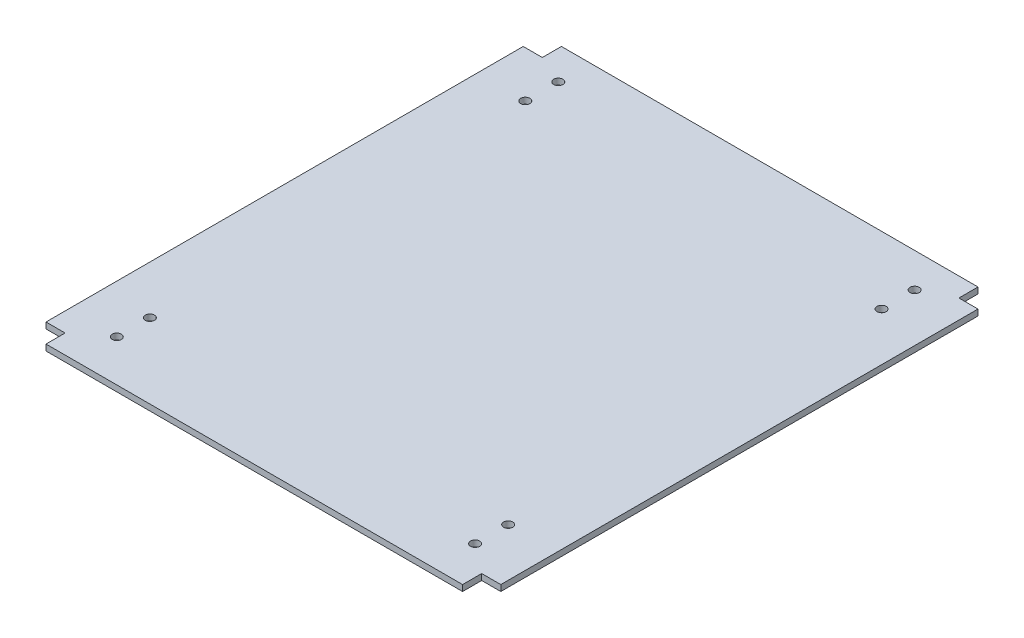
ISO-10303-21;
HEADER;
FILE_DESCRIPTION(('STEP AP214'),'2;1');
FILE_NAME('part.step','',(''),(''),'','','');
FILE_SCHEMA(('AUTOMOTIVE_DESIGN { 1 0 10303 214 1 1 1 1 }'));
ENDSEC;
DATA;
#1=APPLICATION_CONTEXT('core data for automotive mechanical design processes');
#2=APPLICATION_PROTOCOL_DEFINITION('international standard','automotive_design',2000,#1);
#3=PRODUCT_CONTEXT('',#1,'mechanical');
#4=PRODUCT('Part','Part','',(#3));
#5=PRODUCT_RELATED_PRODUCT_CATEGORY('part','',(#4));
#6=PRODUCT_DEFINITION_FORMATION('','',#4);
#7=PRODUCT_DEFINITION_CONTEXT('part definition',#1,'design');
#8=PRODUCT_DEFINITION('design','',#6,#7);
#9=PRODUCT_DEFINITION_SHAPE('','',#8);
#10=(LENGTH_UNIT() NAMED_UNIT(*) SI_UNIT(.MILLI.,.METRE.));
#11=(NAMED_UNIT(*) PLANE_ANGLE_UNIT() SI_UNIT($,.RADIAN.));
#12=(NAMED_UNIT(*) SI_UNIT($,.STERADIAN.) SOLID_ANGLE_UNIT());
#13=UNCERTAINTY_MEASURE_WITH_UNIT(LENGTH_MEASURE(1.E-05),#10,'distance_accuracy_value','');
#14=(GEOMETRIC_REPRESENTATION_CONTEXT(3) GLOBAL_UNCERTAINTY_ASSIGNED_CONTEXT((#13)) GLOBAL_UNIT_ASSIGNED_CONTEXT((#10,
#11,#12)) REPRESENTATION_CONTEXT('',''));
#15=CARTESIAN_POINT('',(0.,0.,0.));
#16=DIRECTION('',(0.,0.,1.));
#17=DIRECTION('',(1.,0.,0.));
#18=AXIS2_PLACEMENT_3D('',#15,#16,#17);
#19=CARTESIAN_POINT('',(-218.125,6.35,269.875));
#20=DIRECTION('',(1.,0.,0.));
#21=DIRECTION('',(0.,0.,-1.));
#22=AXIS2_PLACEMENT_3D('',#19,#20,#21);
#23=PLANE('',#22);
#24=DIRECTION('',(0.,0.,1.));
#25=VECTOR('',#24,1.);
#26=CARTESIAN_POINT('',(-218.125,0.,269.875));
#27=LINE('',#26,#25);
#28=CARTESIAN_POINT('',(-218.125,0.,249.875));
#29=VERTEX_POINT('',#28);
#30=CARTESIAN_POINT('',(-218.125,0.,269.875));
#31=VERTEX_POINT('',#30);
#32=EDGE_CURVE('E158',#29,#31,#27,.T.);
#33=ORIENTED_EDGE('',*,*,#32,.T.);
#34=DIRECTION('',(0.,-1.,0.));
#35=VECTOR('',#34,1.);
#36=CARTESIAN_POINT('',(-218.125,6.35,269.875));
#37=LINE('',#36,#35);
#38=CARTESIAN_POINT('',(-218.125,6.35,269.875));
#39=VERTEX_POINT('',#38);
#40=EDGE_CURVE('E11',#39,#31,#37,.T.);
#41=ORIENTED_EDGE('',*,*,#40,.F.);
#42=DIRECTION('',(0.,0.,1.));
#43=VECTOR('',#42,1.);
#44=CARTESIAN_POINT('',(-218.125,6.35,269.875));
#45=LINE('',#44,#43);
#46=CARTESIAN_POINT('',(-218.125,6.35,249.875));
#47=VERTEX_POINT('',#46);
#48=EDGE_CURVE('E181',#47,#39,#45,.T.);
#49=ORIENTED_EDGE('',*,*,#48,.F.);
#50=DIRECTION('',(0.,-1.,0.));
#51=VECTOR('',#50,1.);
#52=CARTESIAN_POINT('',(-218.125,6.35,249.875));
#53=LINE('',#52,#51);
#54=EDGE_CURVE('E154',#47,#29,#53,.T.);
#55=ORIENTED_EDGE('',*,*,#54,.T.);
#56=EDGE_LOOP('',(#33,#41,#49,#55));
#57=FACE_BOUND('',#56,.T.);
#58=ADVANCED_FACE('F36',(#57),#23,.F.);
#59=CARTESIAN_POINT('',(-218.125,6.35,269.875));
#60=DIRECTION('',(0.,0.,-1.));
#61=DIRECTION('',(-1.,0.,0.));
#62=AXIS2_PLACEMENT_3D('',#59,#60,#61);
#63=PLANE('',#62);
#64=DIRECTION('',(1.,0.,0.));
#65=VECTOR('',#64,1.);
#66=CARTESIAN_POINT('',(-218.125,0.,269.875));
#67=LINE('',#66,#65);
#68=CARTESIAN_POINT('',(218.125,0.,269.875));
#69=VERTEX_POINT('',#68);
#70=EDGE_CURVE('E161',#31,#69,#67,.T.);
#71=ORIENTED_EDGE('',*,*,#70,.T.);
#72=DIRECTION('',(0.,-1.,0.));
#73=VECTOR('',#72,1.);
#74=CARTESIAN_POINT('',(218.125,6.35,269.875));
#75=LINE('',#74,#73);
#76=CARTESIAN_POINT('',(218.125,6.35,269.875));
#77=VERTEX_POINT('',#76);
#78=EDGE_CURVE('E45',#77,#69,#75,.T.);
#79=ORIENTED_EDGE('',*,*,#78,.F.);
#80=DIRECTION('',(1.,0.,0.));
#81=VECTOR('',#80,1.);
#82=CARTESIAN_POINT('',(-218.125,6.35,269.875));
#83=LINE('',#82,#81);
#84=EDGE_CURVE('E109',#39,#77,#83,.T.);
#85=ORIENTED_EDGE('',*,*,#84,.F.);
#86=ORIENTED_EDGE('',*,*,#40,.T.);
#87=EDGE_LOOP('',(#71,#79,#85,#86));
#88=FACE_BOUND('',#87,.T.);
#89=ADVANCED_FACE('F296',(#88),#63,.F.);
#90=CARTESIAN_POINT('',(218.125,6.35,269.875));
#91=DIRECTION('',(-1.,0.,0.));
#92=DIRECTION('',(0.,0.,1.));
#93=AXIS2_PLACEMENT_3D('',#90,#91,#92);
#94=PLANE('',#93);
#95=DIRECTION('',(0.,0.,-1.));
#96=VECTOR('',#95,1.);
#97=CARTESIAN_POINT('',(218.125,0.,269.875));
#98=LINE('',#97,#96);
#99=CARTESIAN_POINT('',(218.125,0.,249.875));
#100=VERTEX_POINT('',#99);
#101=EDGE_CURVE('E164',#69,#100,#98,.T.);
#102=ORIENTED_EDGE('',*,*,#101,.T.);
#103=DIRECTION('',(0.,-1.,0.));
#104=VECTOR('',#103,1.);
#105=CARTESIAN_POINT('',(218.125,6.35,249.875));
#106=LINE('',#105,#104);
#107=CARTESIAN_POINT('',(218.125,6.35,249.875));
#108=VERTEX_POINT('',#107);
#109=EDGE_CURVE('E200',#108,#100,#106,.T.);
#110=ORIENTED_EDGE('',*,*,#109,.F.);
#111=DIRECTION('',(0.,0.,-1.));
#112=VECTOR('',#111,1.);
#113=CARTESIAN_POINT('',(218.125,6.35,269.875));
#114=LINE('',#113,#112);
#115=EDGE_CURVE('E255',#77,#108,#114,.T.);
#116=ORIENTED_EDGE('',*,*,#115,.F.);
#117=ORIENTED_EDGE('',*,*,#78,.T.);
#118=EDGE_LOOP('',(#102,#110,#116,#117));
#119=FACE_BOUND('',#118,.T.);
#120=ADVANCED_FACE('F300',(#119),#94,.F.);
#121=CARTESIAN_POINT('',(238.125,6.35,249.875));
#122=DIRECTION('',(0.,0.,-1.));
#123=DIRECTION('',(-1.,0.,0.));
#124=AXIS2_PLACEMENT_3D('',#121,#122,#123);
#125=PLANE('',#124);
#126=DIRECTION('',(1.,0.,0.));
#127=VECTOR('',#126,1.);
#128=CARTESIAN_POINT('',(238.125,0.,249.875));
#129=LINE('',#128,#127);
#130=CARTESIAN_POINT('',(238.125,0.,249.875));
#131=VERTEX_POINT('',#130);
#132=EDGE_CURVE('E166',#100,#131,#129,.T.);
#133=ORIENTED_EDGE('',*,*,#132,.T.);
#134=DIRECTION('',(0.,-1.,0.));
#135=VECTOR('',#134,1.);
#136=CARTESIAN_POINT('',(238.125,6.35,249.875));
#137=LINE('',#136,#135);
#138=CARTESIAN_POINT('',(238.125,6.35,249.875));
#139=VERTEX_POINT('',#138);
#140=EDGE_CURVE('E197',#139,#131,#137,.T.);
#141=ORIENTED_EDGE('',*,*,#140,.F.);
#142=DIRECTION('',(1.,0.,0.));
#143=VECTOR('',#142,1.);
#144=CARTESIAN_POINT('',(238.125,6.35,249.875));
#145=LINE('',#144,#143);
#146=EDGE_CURVE('E257',#108,#139,#145,.T.);
#147=ORIENTED_EDGE('',*,*,#146,.F.);
#148=ORIENTED_EDGE('',*,*,#109,.T.);
#149=EDGE_LOOP('',(#133,#141,#147,#148));
#150=FACE_BOUND('',#149,.T.);
#151=ADVANCED_FACE('F304',(#150),#125,.F.);
#152=CARTESIAN_POINT('',(238.125,6.35,-249.875));
#153=DIRECTION('',(-1.,0.,0.));
#154=DIRECTION('',(0.,0.,1.));
#155=AXIS2_PLACEMENT_3D('',#152,#153,#154);
#156=PLANE('',#155);
#157=DIRECTION('',(0.,0.,-1.));
#158=VECTOR('',#157,1.);
#159=CARTESIAN_POINT('',(238.125,0.,-249.875));
#160=LINE('',#159,#158);
#161=CARTESIAN_POINT('',(238.125,0.,-249.875));
#162=VERTEX_POINT('',#161);
#163=EDGE_CURVE('E168',#131,#162,#160,.T.);
#164=ORIENTED_EDGE('',*,*,#163,.T.);
#165=DIRECTION('',(0.,-1.,0.));
#166=VECTOR('',#165,1.);
#167=CARTESIAN_POINT('',(238.125,6.35,-249.875));
#168=LINE('',#167,#166);
#169=CARTESIAN_POINT('',(238.125,6.35,-249.875));
#170=VERTEX_POINT('',#169);
#171=EDGE_CURVE('E194',#170,#162,#168,.T.);
#172=ORIENTED_EDGE('',*,*,#171,.F.);
#173=DIRECTION('',(0.,0.,-1.));
#174=VECTOR('',#173,1.);
#175=CARTESIAN_POINT('',(238.125,6.35,-249.875));
#176=LINE('',#175,#174);
#177=EDGE_CURVE('E259',#139,#170,#176,.T.);
#178=ORIENTED_EDGE('',*,*,#177,.F.);
#179=ORIENTED_EDGE('',*,*,#140,.T.);
#180=EDGE_LOOP('',(#164,#172,#178,#179));
#181=FACE_BOUND('',#180,.T.);
#182=ADVANCED_FACE('F310',(#181),#156,.F.);
#183=CARTESIAN_POINT('',(238.125,6.35,-249.875));
#184=DIRECTION('',(0.,0.,1.));
#185=DIRECTION('',(1.,0.,0.));
#186=AXIS2_PLACEMENT_3D('',#183,#184,#185);
#187=PLANE('',#186);
#188=DIRECTION('',(-1.,0.,0.));
#189=VECTOR('',#188,1.);
#190=CARTESIAN_POINT('',(238.125,0.,-249.875));
#191=LINE('',#190,#189);
#192=CARTESIAN_POINT('',(218.125,0.,-249.875));
#193=VERTEX_POINT('',#192);
#194=EDGE_CURVE('E170',#162,#193,#191,.T.);
#195=ORIENTED_EDGE('',*,*,#194,.T.);
#196=DIRECTION('',(0.,-1.,0.));
#197=VECTOR('',#196,1.);
#198=CARTESIAN_POINT('',(218.125,6.35,-249.875));
#199=LINE('',#198,#197);
#200=CARTESIAN_POINT('',(218.125,6.35,-249.875));
#201=VERTEX_POINT('',#200);
#202=EDGE_CURVE('E191',#201,#193,#199,.T.);
#203=ORIENTED_EDGE('',*,*,#202,.F.);
#204=DIRECTION('',(-1.,0.,0.));
#205=VECTOR('',#204,1.);
#206=CARTESIAN_POINT('',(238.125,6.35,-249.875));
#207=LINE('',#206,#205);
#208=EDGE_CURVE('E261',#170,#201,#207,.T.);
#209=ORIENTED_EDGE('',*,*,#208,.F.);
#210=ORIENTED_EDGE('',*,*,#171,.T.);
#211=EDGE_LOOP('',(#195,#203,#209,#210));
#212=FACE_BOUND('',#211,.T.);
#213=ADVANCED_FACE('F314',(#212),#187,.F.);
#214=CARTESIAN_POINT('',(218.125,6.35,-269.875));
#215=DIRECTION('',(-1.,0.,0.));
#216=DIRECTION('',(0.,0.,1.));
#217=AXIS2_PLACEMENT_3D('',#214,#215,#216);
#218=PLANE('',#217);
#219=DIRECTION('',(0.,0.,-1.));
#220=VECTOR('',#219,1.);
#221=CARTESIAN_POINT('',(218.125,0.,-269.875));
#222=LINE('',#221,#220);
#223=CARTESIAN_POINT('',(218.125,0.,-269.875));
#224=VERTEX_POINT('',#223);
#225=EDGE_CURVE('E172',#193,#224,#222,.T.);
#226=ORIENTED_EDGE('',*,*,#225,.T.);
#227=DIRECTION('',(0.,-1.,0.));
#228=VECTOR('',#227,1.);
#229=CARTESIAN_POINT('',(218.125,6.35,-269.875));
#230=LINE('',#229,#228);
#231=CARTESIAN_POINT('',(218.125,6.35,-269.875));
#232=VERTEX_POINT('',#231);
#233=EDGE_CURVE('E188',#232,#224,#230,.T.);
#234=ORIENTED_EDGE('',*,*,#233,.F.);
#235=DIRECTION('',(0.,0.,-1.));
#236=VECTOR('',#235,1.);
#237=CARTESIAN_POINT('',(218.125,6.35,-269.875));
#238=LINE('',#237,#236);
#239=EDGE_CURVE('E263',#201,#232,#238,.T.);
#240=ORIENTED_EDGE('',*,*,#239,.F.);
#241=ORIENTED_EDGE('',*,*,#202,.T.);
#242=EDGE_LOOP('',(#226,#234,#240,#241));
#243=FACE_BOUND('',#242,.T.);
#244=ADVANCED_FACE('F318',(#243),#218,.F.);
#245=CARTESIAN_POINT('',(-218.125,6.35,-269.875));
#246=DIRECTION('',(0.,0.,1.));
#247=DIRECTION('',(1.,0.,0.));
#248=AXIS2_PLACEMENT_3D('',#245,#246,#247);
#249=PLANE('',#248);
#250=DIRECTION('',(-1.,0.,0.));
#251=VECTOR('',#250,1.);
#252=CARTESIAN_POINT('',(-218.125,0.,-269.875));
#253=LINE('',#252,#251);
#254=CARTESIAN_POINT('',(-218.125,0.,-269.875));
#255=VERTEX_POINT('',#254);
#256=EDGE_CURVE('E174',#224,#255,#253,.T.);
#257=ORIENTED_EDGE('',*,*,#256,.T.);
#258=DIRECTION('',(0.,-1.,0.));
#259=VECTOR('',#258,1.);
#260=CARTESIAN_POINT('',(-218.125,6.35,-269.875));
#261=LINE('',#260,#259);
#262=CARTESIAN_POINT('',(-218.125,6.35,-269.875));
#263=VERTEX_POINT('',#262);
#264=EDGE_CURVE('E185',#263,#255,#261,.T.);
#265=ORIENTED_EDGE('',*,*,#264,.F.);
#266=DIRECTION('',(-1.,0.,0.));
#267=VECTOR('',#266,1.);
#268=CARTESIAN_POINT('',(-218.125,6.35,-269.875));
#269=LINE('',#268,#267);
#270=EDGE_CURVE('E265',#232,#263,#269,.T.);
#271=ORIENTED_EDGE('',*,*,#270,.F.);
#272=ORIENTED_EDGE('',*,*,#233,.T.);
#273=EDGE_LOOP('',(#257,#265,#271,#272));
#274=FACE_BOUND('',#273,.T.);
#275=ADVANCED_FACE('F271',(#274),#249,.F.);
#276=CARTESIAN_POINT('',(-218.125,6.35,-269.875));
#277=DIRECTION('',(1.,0.,0.));
#278=DIRECTION('',(0.,0.,-1.));
#279=AXIS2_PLACEMENT_3D('',#276,#277,#278);
#280=PLANE('',#279);
#281=DIRECTION('',(0.,0.,1.));
#282=VECTOR('',#281,1.);
#283=CARTESIAN_POINT('',(-218.125,0.,-269.875));
#284=LINE('',#283,#282);
#285=CARTESIAN_POINT('',(-218.125,0.,-249.875));
#286=VERTEX_POINT('',#285);
#287=EDGE_CURVE('E176',#255,#286,#284,.T.);
#288=ORIENTED_EDGE('',*,*,#287,.T.);
#289=DIRECTION('',(0.,-1.,0.));
#290=VECTOR('',#289,1.);
#291=CARTESIAN_POINT('',(-218.125,6.35,-249.875));
#292=LINE('',#291,#290);
#293=CARTESIAN_POINT('',(-218.125,6.35,-249.875));
#294=VERTEX_POINT('',#293);
#295=EDGE_CURVE('E149',#294,#286,#292,.T.);
#296=ORIENTED_EDGE('',*,*,#295,.F.);
#297=DIRECTION('',(0.,0.,1.));
#298=VECTOR('',#297,1.);
#299=CARTESIAN_POINT('',(-218.125,6.35,-269.875));
#300=LINE('',#299,#298);
#301=EDGE_CURVE('E140',#263,#294,#300,.T.);
#302=ORIENTED_EDGE('',*,*,#301,.F.);
#303=ORIENTED_EDGE('',*,*,#264,.T.);
#304=EDGE_LOOP('',(#288,#296,#302,#303));
#305=FACE_BOUND('',#304,.T.);
#306=ADVANCED_FACE('F275',(#305),#280,.F.);
#307=CARTESIAN_POINT('',(-238.125,6.35,-249.875));
#308=DIRECTION('',(0.,0.,1.));
#309=DIRECTION('',(1.,0.,0.));
#310=AXIS2_PLACEMENT_3D('',#307,#308,#309);
#311=PLANE('',#310);
#312=DIRECTION('',(-1.,0.,0.));
#313=VECTOR('',#312,1.);
#314=CARTESIAN_POINT('',(-238.125,0.,-249.875));
#315=LINE('',#314,#313);
#316=CARTESIAN_POINT('',(-238.125,0.,-249.875));
#317=VERTEX_POINT('',#316);
#318=EDGE_CURVE('E148',#286,#317,#315,.T.);
#319=ORIENTED_EDGE('',*,*,#318,.T.);
#320=DIRECTION('',(0.,-1.,0.));
#321=VECTOR('',#320,1.);
#322=CARTESIAN_POINT('',(-238.125,6.35,-249.875));
#323=LINE('',#322,#321);
#324=CARTESIAN_POINT('',(-238.125,6.35,-249.875));
#325=VERTEX_POINT('',#324);
#326=EDGE_CURVE('E145',#325,#317,#323,.T.);
#327=ORIENTED_EDGE('',*,*,#326,.F.);
#328=DIRECTION('',(-1.,0.,0.));
#329=VECTOR('',#328,1.);
#330=CARTESIAN_POINT('',(-238.125,6.35,-249.875));
#331=LINE('',#330,#329);
#332=EDGE_CURVE('E134',#294,#325,#331,.T.);
#333=ORIENTED_EDGE('',*,*,#332,.F.);
#334=ORIENTED_EDGE('',*,*,#295,.T.);
#335=EDGE_LOOP('',(#319,#327,#333,#334));
#336=FACE_BOUND('',#335,.T.);
#337=ADVANCED_FACE('F146',(#336),#311,.F.);
#338=CARTESIAN_POINT('',(-238.125,6.35,-249.875));
#339=DIRECTION('',(1.,0.,0.));
#340=DIRECTION('',(0.,0.,-1.));
#341=AXIS2_PLACEMENT_3D('',#338,#339,#340);
#342=PLANE('',#341);
#343=DIRECTION('',(0.,0.,1.));
#344=VECTOR('',#343,1.);
#345=CARTESIAN_POINT('',(-238.125,0.,-249.875));
#346=LINE('',#345,#344);
#347=CARTESIAN_POINT('',(-238.125,0.,249.875));
#348=VERTEX_POINT('',#347);
#349=EDGE_CURVE('E95',#317,#348,#346,.T.);
#350=ORIENTED_EDGE('',*,*,#349,.T.);
#351=DIRECTION('',(0.,-1.,0.));
#352=VECTOR('',#351,1.);
#353=CARTESIAN_POINT('',(-238.125,6.35,249.875));
#354=LINE('',#353,#352);
#355=CARTESIAN_POINT('',(-238.125,6.35,249.875));
#356=VERTEX_POINT('',#355);
#357=EDGE_CURVE('E150',#356,#348,#354,.T.);
#358=ORIENTED_EDGE('',*,*,#357,.F.);
#359=DIRECTION('',(0.,0.,1.));
#360=VECTOR('',#359,1.);
#361=CARTESIAN_POINT('',(-238.125,6.35,-249.875));
#362=LINE('',#361,#360);
#363=EDGE_CURVE('E138',#325,#356,#362,.T.);
#364=ORIENTED_EDGE('',*,*,#363,.F.);
#365=ORIENTED_EDGE('',*,*,#326,.T.);
#366=EDGE_LOOP('',(#350,#358,#364,#365));
#367=FACE_BOUND('',#366,.T.);
#368=ADVANCED_FACE('F152',(#367),#342,.F.);
#369=CARTESIAN_POINT('',(-238.125,6.35,249.875));
#370=DIRECTION('',(0.,0.,-1.));
#371=DIRECTION('',(-1.,0.,0.));
#372=AXIS2_PLACEMENT_3D('',#369,#370,#371);
#373=PLANE('',#372);
#374=DIRECTION('',(1.,0.,0.));
#375=VECTOR('',#374,1.);
#376=CARTESIAN_POINT('',(-238.125,0.,249.875));
#377=LINE('',#376,#375);
#378=EDGE_CURVE('E101',#348,#29,#377,.T.);
#379=ORIENTED_EDGE('',*,*,#378,.T.);
#380=ORIENTED_EDGE('',*,*,#54,.F.);
#381=DIRECTION('',(1.,0.,0.));
#382=VECTOR('',#381,1.);
#383=CARTESIAN_POINT('',(-238.125,6.35,249.875));
#384=LINE('',#383,#382);
#385=EDGE_CURVE('E54',#356,#47,#384,.T.);
#386=ORIENTED_EDGE('',*,*,#385,.F.);
#387=ORIENTED_EDGE('',*,*,#357,.T.);
#388=EDGE_LOOP('',(#379,#380,#386,#387));
#389=FACE_BOUND('',#388,.T.);
#390=ADVANCED_FACE('F283',(#389),#373,.F.);
#391=CARTESIAN_POINT('',(0.,6.35,0.));
#392=DIRECTION('',(0.,-1.,0.));
#393=DIRECTION('',(0.,0.,-1.));
#394=AXIS2_PLACEMENT_3D('',#391,#392,#393);
#395=PLANE('',#394);
#396=CARTESIAN_POINT('',(187.640185321589,6.34999999999999,226.256317912072));
#397=DIRECTION('',(0.,-1.,0.));
#398=DIRECTION('',(0.,0.,-1.));
#399=AXIS2_PLACEMENT_3D('',#396,#397,#398);
#400=CIRCLE('',#399,4.826);
#401=CARTESIAN_POINT('',(187.640185321589,6.34999999999999,221.430317912072));
#402=VERTEX_POINT('',#401);
#403=EDGE_CURVE('E217',#402,#402,#400,.T.);
#404=ORIENTED_EDGE('',*,*,#403,.T.);
#405=EDGE_LOOP('',(#404));
#406=FACE_BOUND('',#405,.T.);
#407=CARTESIAN_POINT('',(187.640185321589,6.34999999999999,191.656317912072));
#408=DIRECTION('',(0.,-1.,0.));
#409=DIRECTION('',(0.,0.,-1.));
#410=AXIS2_PLACEMENT_3D('',#407,#408,#409);
#411=CIRCLE('',#410,4.826);
#412=CARTESIAN_POINT('',(187.640185321589,6.34999999999999,186.830317912072));
#413=VERTEX_POINT('',#412);
#414=EDGE_CURVE('E223',#413,#413,#411,.T.);
#415=ORIENTED_EDGE('',*,*,#414,.T.);
#416=EDGE_LOOP('',(#415));
#417=FACE_BOUND('',#416,.T.);
#418=CARTESIAN_POINT('',(-187.629985321598,6.34999999999999,226.256317912071));
#419=DIRECTION('',(0.,-1.,0.));
#420=DIRECTION('',(0.,0.,-1.));
#421=AXIS2_PLACEMENT_3D('',#418,#419,#420);
#422=CIRCLE('',#421,4.82600000000002);
#423=CARTESIAN_POINT('',(-187.629985321598,6.34999999999999,221.430317912071));
#424=VERTEX_POINT('',#423);
#425=EDGE_CURVE('E220',#424,#424,#422,.T.);
#426=ORIENTED_EDGE('',*,*,#425,.T.);
#427=EDGE_LOOP('',(#426));
#428=FACE_BOUND('',#427,.T.);
#429=CARTESIAN_POINT('',(-187.629985321598,6.34999999999999,191.656317912071));
#430=DIRECTION('',(0.,-1.,0.));
#431=DIRECTION('',(0.,0.,-1.));
#432=AXIS2_PLACEMENT_3D('',#429,#430,#431);
#433=CIRCLE('',#432,4.82600000000002);
#434=CARTESIAN_POINT('',(-187.629985321598,6.34999999999999,186.830317912071));
#435=VERTEX_POINT('',#434);
#436=EDGE_CURVE('E216',#435,#435,#433,.T.);
#437=ORIENTED_EDGE('',*,*,#436,.T.);
#438=EDGE_LOOP('',(#437));
#439=FACE_BOUND('',#438,.T.);
#440=CARTESIAN_POINT('',(187.640185321591,6.35,-199.400104096064));
#441=DIRECTION('',(0.,-1.,0.));
#442=DIRECTION('',(0.,0.,-1.));
#443=AXIS2_PLACEMENT_3D('',#440,#441,#442);
#444=CIRCLE('',#443,4.82599999999999);
#445=CARTESIAN_POINT('',(187.640185321591,6.35,-204.226104096064));
#446=VERTEX_POINT('',#445);
#447=EDGE_CURVE('E209',#446,#446,#444,.T.);
#448=ORIENTED_EDGE('',*,*,#447,.T.);
#449=EDGE_LOOP('',(#448));
#450=FACE_BOUND('',#449,.T.);
#451=CARTESIAN_POINT('',(187.640185321591,6.35,-234.000104096064));
#452=DIRECTION('',(0.,-1.,0.));
#453=DIRECTION('',(0.,0.,-1.));
#454=AXIS2_PLACEMENT_3D('',#451,#452,#453);
#455=CIRCLE('',#454,4.82599999999999);
#456=CARTESIAN_POINT('',(187.640185321591,6.35,-238.826104096064));
#457=VERTEX_POINT('',#456);
#458=EDGE_CURVE('E242',#457,#457,#455,.T.);
#459=ORIENTED_EDGE('',*,*,#458,.T.);
#460=EDGE_LOOP('',(#459));
#461=FACE_BOUND('',#460,.T.);
#462=CARTESIAN_POINT('',(-187.629985321598,6.34999999999999,-201.520965762816));
#463=DIRECTION('',(0.,-1.,0.));
#464=DIRECTION('',(0.,0.,-1.));
#465=AXIS2_PLACEMENT_3D('',#462,#463,#464);
#466=CIRCLE('',#465,4.82599999999999);
#467=CARTESIAN_POINT('',(-187.629985321598,6.34999999999999,-206.346965762816));
#468=VERTEX_POINT('',#467);
#469=EDGE_CURVE('E162',#468,#468,#466,.T.);
#470=ORIENTED_EDGE('',*,*,#469,.T.);
#471=EDGE_LOOP('',(#470));
#472=FACE_BOUND('',#471,.T.);
#473=CARTESIAN_POINT('',(-187.629985321598,6.34999999999999,-236.120965762816));
#474=DIRECTION('',(0.,-1.,0.));
#475=DIRECTION('',(0.,0.,-1.));
#476=AXIS2_PLACEMENT_3D('',#473,#474,#475);
#477=CIRCLE('',#476,4.82599999999999);
#478=CARTESIAN_POINT('',(-187.629985321598,6.34999999999999,-240.946965762816));
#479=VERTEX_POINT('',#478);
#480=EDGE_CURVE('E208',#479,#479,#477,.T.);
#481=ORIENTED_EDGE('',*,*,#480,.T.);
#482=EDGE_LOOP('',(#481));
#483=FACE_BOUND('',#482,.T.);
#484=ORIENTED_EDGE('',*,*,#48,.T.);
#485=ORIENTED_EDGE('',*,*,#84,.T.);
#486=ORIENTED_EDGE('',*,*,#115,.T.);
#487=ORIENTED_EDGE('',*,*,#146,.T.);
#488=ORIENTED_EDGE('',*,*,#177,.T.);
#489=ORIENTED_EDGE('',*,*,#208,.T.);
#490=ORIENTED_EDGE('',*,*,#239,.T.);
#491=ORIENTED_EDGE('',*,*,#270,.T.);
#492=ORIENTED_EDGE('',*,*,#301,.T.);
#493=ORIENTED_EDGE('',*,*,#332,.T.);
#494=ORIENTED_EDGE('',*,*,#363,.T.);
#495=ORIENTED_EDGE('',*,*,#385,.T.);
#496=EDGE_LOOP('',(#484,#485,#486,#487,#488,#489,#490,#491,#492,#493,#494,#495));
#497=FACE_BOUND('',#496,.T.);
#498=ADVANCED_FACE('F136',(#406,#417,#428,#439,#450,#461,#472,#483,#497),#395,.F.);
#499=CARTESIAN_POINT('',(0.,0.,0.));
#500=DIRECTION('',(0.,-1.,0.));
#501=DIRECTION('',(0.,0.,-1.));
#502=AXIS2_PLACEMENT_3D('',#499,#500,#501);
#503=PLANE('',#502);
#504=CARTESIAN_POINT('',(187.640185321589,0.,226.256317912072));
#505=DIRECTION('',(0.,-1.,0.));
#506=DIRECTION('',(0.,0.,-1.));
#507=AXIS2_PLACEMENT_3D('',#504,#505,#506);
#508=CIRCLE('',#507,4.826);
#509=CARTESIAN_POINT('',(187.640185321589,0.,221.430317912072));
#510=VERTEX_POINT('',#509);
#511=EDGE_CURVE('E39',#510,#510,#508,.T.);
#512=ORIENTED_EDGE('',*,*,#511,.F.);
#513=EDGE_LOOP('',(#512));
#514=FACE_BOUND('',#513,.T.);
#515=CARTESIAN_POINT('',(187.640185321589,0.,191.656317912072));
#516=DIRECTION('',(0.,-1.,0.));
#517=DIRECTION('',(0.,0.,-1.));
#518=AXIS2_PLACEMENT_3D('',#515,#516,#517);
#519=CIRCLE('',#518,4.826);
#520=CARTESIAN_POINT('',(187.640185321589,0.,186.830317912072));
#521=VERTEX_POINT('',#520);
#522=EDGE_CURVE('E221',#521,#521,#519,.T.);
#523=ORIENTED_EDGE('',*,*,#522,.F.);
#524=EDGE_LOOP('',(#523));
#525=FACE_BOUND('',#524,.T.);
#526=CARTESIAN_POINT('',(-187.629985321598,0.,226.256317912071));
#527=DIRECTION('',(0.,-1.,0.));
#528=DIRECTION('',(0.,0.,-1.));
#529=AXIS2_PLACEMENT_3D('',#526,#527,#528);
#530=CIRCLE('',#529,4.82600000000002);
#531=CARTESIAN_POINT('',(-187.629985321598,0.,221.430317912071));
#532=VERTEX_POINT('',#531);
#533=EDGE_CURVE('E218',#532,#532,#530,.T.);
#534=ORIENTED_EDGE('',*,*,#533,.F.);
#535=EDGE_LOOP('',(#534));
#536=FACE_BOUND('',#535,.T.);
#537=CARTESIAN_POINT('',(-187.629985321598,0.,191.656317912071));
#538=DIRECTION('',(0.,-1.,0.));
#539=DIRECTION('',(0.,0.,-1.));
#540=AXIS2_PLACEMENT_3D('',#537,#538,#539);
#541=CIRCLE('',#540,4.82600000000002);
#542=CARTESIAN_POINT('',(-187.629985321598,0.,186.830317912071));
#543=VERTEX_POINT('',#542);
#544=EDGE_CURVE('E213',#543,#543,#541,.T.);
#545=ORIENTED_EDGE('',*,*,#544,.F.);
#546=EDGE_LOOP('',(#545));
#547=FACE_BOUND('',#546,.T.);
#548=CARTESIAN_POINT('',(187.640185321591,0.,-199.400104096064));
#549=DIRECTION('',(0.,-1.,0.));
#550=DIRECTION('',(0.,0.,-1.));
#551=AXIS2_PLACEMENT_3D('',#548,#549,#550);
#552=CIRCLE('',#551,4.82599999999999);
#553=CARTESIAN_POINT('',(187.640185321591,0.,-204.226104096064));
#554=VERTEX_POINT('',#553);
#555=EDGE_CURVE('E239',#554,#554,#552,.T.);
#556=ORIENTED_EDGE('',*,*,#555,.F.);
#557=EDGE_LOOP('',(#556));
#558=FACE_BOUND('',#557,.T.);
#559=CARTESIAN_POINT('',(187.640185321591,0.,-234.000104096064));
#560=DIRECTION('',(0.,-1.,0.));
#561=DIRECTION('',(0.,0.,-1.));
#562=AXIS2_PLACEMENT_3D('',#559,#560,#561);
#563=CIRCLE('',#562,4.82599999999999);
#564=CARTESIAN_POINT('',(187.640185321591,0.,-238.826104096064));
#565=VERTEX_POINT('',#564);
#566=EDGE_CURVE('E238',#565,#565,#563,.T.);
#567=ORIENTED_EDGE('',*,*,#566,.F.);
#568=EDGE_LOOP('',(#567));
#569=FACE_BOUND('',#568,.T.);
#570=CARTESIAN_POINT('',(-187.629985321598,0.,-201.520965762816));
#571=DIRECTION('',(0.,-1.,0.));
#572=DIRECTION('',(0.,0.,-1.));
#573=AXIS2_PLACEMENT_3D('',#570,#571,#572);
#574=CIRCLE('',#573,4.82599999999999);
#575=CARTESIAN_POINT('',(-187.629985321598,0.,-206.346965762816));
#576=VERTEX_POINT('',#575);
#577=EDGE_CURVE('E210',#576,#576,#574,.T.);
#578=ORIENTED_EDGE('',*,*,#577,.F.);
#579=EDGE_LOOP('',(#578));
#580=FACE_BOUND('',#579,.T.);
#581=CARTESIAN_POINT('',(-187.629985321598,0.,-236.120965762816));
#582=DIRECTION('',(0.,-1.,0.));
#583=DIRECTION('',(0.,0.,-1.));
#584=AXIS2_PLACEMENT_3D('',#581,#582,#583);
#585=CIRCLE('',#584,4.82599999999999);
#586=CARTESIAN_POINT('',(-187.629985321598,0.,-240.946965762816));
#587=VERTEX_POINT('',#586);
#588=EDGE_CURVE('E205',#587,#587,#585,.T.);
#589=ORIENTED_EDGE('',*,*,#588,.F.);
#590=EDGE_LOOP('',(#589));
#591=FACE_BOUND('',#590,.T.);
#592=ORIENTED_EDGE('',*,*,#32,.F.);
#593=ORIENTED_EDGE('',*,*,#378,.F.);
#594=ORIENTED_EDGE('',*,*,#349,.F.);
#595=ORIENTED_EDGE('',*,*,#318,.F.);
#596=ORIENTED_EDGE('',*,*,#287,.F.);
#597=ORIENTED_EDGE('',*,*,#256,.F.);
#598=ORIENTED_EDGE('',*,*,#225,.F.);
#599=ORIENTED_EDGE('',*,*,#194,.F.);
#600=ORIENTED_EDGE('',*,*,#163,.F.);
#601=ORIENTED_EDGE('',*,*,#132,.F.);
#602=ORIENTED_EDGE('',*,*,#101,.F.);
#603=ORIENTED_EDGE('',*,*,#70,.F.);
#604=EDGE_LOOP('',(#592,#593,#594,#595,#596,#597,#598,#599,#600,#601,#602,#603));
#605=FACE_BOUND('',#604,.T.);
#606=ADVANCED_FACE('F278',(#514,#525,#536,#547,#558,#569,#580,#591,#605),#503,.T.);
#607=CARTESIAN_POINT('',(-187.629985321598,106.474000000001,-236.120965762816));
#608=DIRECTION('',(0.,-1.,0.));
#609=DIRECTION('',(1.,0.,0.));
#610=AXIS2_PLACEMENT_3D('',#607,#608,#609);
#611=CYLINDRICAL_SURFACE('',#610,4.82599999999999);
#612=ORIENTED_EDGE('',*,*,#588,.T.);
#613=EDGE_LOOP('',(#612));
#614=FACE_BOUND('',#613,.T.);
#615=ORIENTED_EDGE('',*,*,#480,.F.);
#616=EDGE_LOOP('',(#615));
#617=FACE_BOUND('',#616,.T.);
#618=ADVANCED_FACE('F346',(#614,#617),#611,.F.);
#619=CARTESIAN_POINT('',(-187.629985321598,106.474000000001,-201.520965762816));
#620=DIRECTION('',(0.,-1.,0.));
#621=DIRECTION('',(1.,0.,0.));
#622=AXIS2_PLACEMENT_3D('',#619,#620,#621);
#623=CYLINDRICAL_SURFACE('',#622,4.82599999999999);
#624=ORIENTED_EDGE('',*,*,#577,.T.);
#625=EDGE_LOOP('',(#624));
#626=FACE_BOUND('',#625,.T.);
#627=ORIENTED_EDGE('',*,*,#469,.F.);
#628=EDGE_LOOP('',(#627));
#629=FACE_BOUND('',#628,.T.);
#630=ADVANCED_FACE('F351',(#626,#629),#623,.F.);
#631=CARTESIAN_POINT('',(187.640185321591,42.164,-234.000104096064));
#632=DIRECTION('',(0.,-1.,0.));
#633=DIRECTION('',(0.,0.,-1.));
#634=AXIS2_PLACEMENT_3D('',#631,#632,#633);
#635=CYLINDRICAL_SURFACE('',#634,4.82599999999999);
#636=CARTESIAN_POINT('',(187.640185321591,0.,-238.826104096064));
#637=CARTESIAN_POINT('',(187.640185321591,0.0661458333333411,-238.826104096064));
#638=CARTESIAN_POINT('',(187.640185321591,0.132291666666675,-238.826104096064));
#639=CARTESIAN_POINT('',(187.640185321591,0.264583333333341,-238.826104096064));
#640=CARTESIAN_POINT('',(187.640185321591,0.330729166666673,-238.826104096064));
#641=CARTESIAN_POINT('',(187.640185321591,0.463020833333339,-238.826104096064));
#642=CARTESIAN_POINT('',(187.640185321591,0.529166666666673,-238.826104096064));
#643=CARTESIAN_POINT('',(187.640185321591,0.661458333333339,-238.826104096064));
#644=CARTESIAN_POINT('',(187.640185321591,0.727604166666671,-238.826104096064));
#645=CARTESIAN_POINT('',(187.640185321591,0.859895833333337,-238.826104096064));
#646=CARTESIAN_POINT('',(187.640185321591,0.926041666666671,-238.826104096064));
#647=CARTESIAN_POINT('',(187.640185321591,1.05833333333334,-238.826104096064));
#648=CARTESIAN_POINT('',(187.640185321591,1.12447916666667,-238.826104096064));
#649=CARTESIAN_POINT('',(187.640185321591,1.25677083333334,-238.826104096064));
#650=CARTESIAN_POINT('',(187.640185321591,1.32291666666667,-238.826104096064));
#651=CARTESIAN_POINT('',(187.640185321591,1.45520833333334,-238.826104096064));
#652=CARTESIAN_POINT('',(187.640185321591,1.52135416666667,-238.826104096064));
#653=CARTESIAN_POINT('',(187.640185321591,1.65364583333334,-238.826104096064));
#654=CARTESIAN_POINT('',(187.640185321591,1.71979166666667,-238.826104096064));
#655=CARTESIAN_POINT('',(187.640185321591,1.85208333333334,-238.826104096064));
#656=CARTESIAN_POINT('',(187.640185321591,1.91822916666667,-238.826104096064));
#657=CARTESIAN_POINT('',(187.640185321591,2.05052083333334,-238.826104096064));
#658=CARTESIAN_POINT('',(187.640185321591,2.11666666666667,-238.826104096064));
#659=CARTESIAN_POINT('',(187.640185321591,2.24895833333334,-238.826104096064));
#660=CARTESIAN_POINT('',(187.640185321591,2.31510416666667,-238.826104096064));
#661=CARTESIAN_POINT('',(187.640185321591,2.44739583333334,-238.826104096064));
#662=CARTESIAN_POINT('',(187.640185321591,2.51354166666667,-238.826104096064));
#663=CARTESIAN_POINT('',(187.640185321591,2.64583333333334,-238.826104096064));
#664=CARTESIAN_POINT('',(187.640185321591,2.71197916666667,-238.826104096064));
#665=CARTESIAN_POINT('',(187.640185321591,2.84427083333334,-238.826104096064));
#666=CARTESIAN_POINT('',(187.640185321591,2.91041666666667,-238.826104096064));
#667=CARTESIAN_POINT('',(187.640185321591,3.04270833333334,-238.826104096064));
#668=CARTESIAN_POINT('',(187.640185321591,3.10885416666667,-238.826104096064));
#669=CARTESIAN_POINT('',(187.640185321591,3.24114583333334,-238.826104096064));
#670=CARTESIAN_POINT('',(187.640185321591,3.30729166666667,-238.826104096064));
#671=CARTESIAN_POINT('',(187.640185321591,3.43958333333334,-238.826104096064));
#672=CARTESIAN_POINT('',(187.640185321591,3.50572916666667,-238.826104096064));
#673=CARTESIAN_POINT('',(187.640185321591,3.63802083333334,-238.826104096064));
#674=CARTESIAN_POINT('',(187.640185321591,3.70416666666667,-238.826104096064));
#675=CARTESIAN_POINT('',(187.640185321591,3.83645833333334,-238.826104096064));
#676=CARTESIAN_POINT('',(187.640185321591,3.90260416666667,-238.826104096064));
#677=CARTESIAN_POINT('',(187.640185321591,4.03489583333333,-238.826104096064));
#678=CARTESIAN_POINT('',(187.640185321591,4.10104166666667,-238.826104096064));
#679=CARTESIAN_POINT('',(187.640185321591,4.23333333333334,-238.826104096064));
#680=CARTESIAN_POINT('',(187.640185321591,4.29947916666667,-238.826104096064));
#681=CARTESIAN_POINT('',(187.640185321591,4.43177083333334,-238.826104096064));
#682=CARTESIAN_POINT('',(187.640185321591,4.49791666666667,-238.826104096064));
#683=CARTESIAN_POINT('',(187.640185321591,4.63020833333333,-238.826104096064));
#684=CARTESIAN_POINT('',(187.640185321591,4.69635416666667,-238.826104096064));
#685=CARTESIAN_POINT('',(187.640185321591,4.82864583333334,-238.826104096064));
#686=CARTESIAN_POINT('',(187.640185321591,4.89479166666667,-238.826104096064));
#687=CARTESIAN_POINT('',(187.640185321591,5.02708333333334,-238.826104096064));
#688=CARTESIAN_POINT('',(187.640185321591,5.09322916666667,-238.826104096064));
#689=CARTESIAN_POINT('',(187.640185321591,5.22552083333333,-238.826104096064));
#690=CARTESIAN_POINT('',(187.640185321591,5.29166666666667,-238.826104096064));
#691=CARTESIAN_POINT('',(187.640185321591,5.42395833333334,-238.826104096064));
#692=CARTESIAN_POINT('',(187.640185321591,5.49010416666667,-238.826104096064));
#693=CARTESIAN_POINT('',(187.640185321591,5.62239583333334,-238.826104096064));
#694=CARTESIAN_POINT('',(187.640185321591,5.68854166666667,-238.826104096064));
#695=CARTESIAN_POINT('',(187.640185321591,5.82083333333333,-238.826104096064));
#696=CARTESIAN_POINT('',(187.640185321591,5.88697916666667,-238.826104096064));
#697=CARTESIAN_POINT('',(187.640185321591,6.01927083333334,-238.826104096064));
#698=CARTESIAN_POINT('',(187.640185321591,6.08541666666667,-238.826104096064));
#699=CARTESIAN_POINT('',(187.640185321591,6.21770833333333,-238.826104096064));
#700=CARTESIAN_POINT('',(187.640185321591,6.28385416666667,-238.826104096064));
#701=CARTESIAN_POINT('',(187.640185321591,6.35,-238.826104096064));
#702=B_SPLINE_CURVE_WITH_KNOTS('',3,(#636,#637,#638,#639,#640,#641,#642,#643,#644,#645,#646,
#647,#648,#649,#650,#651,#652,#653,#654,#655,#656,#657,#658,#659,#660,#661,#662,#663,#664,#665,
#666,#667,#668,#669,#670,#671,#672,#673,#674,#675,#676,#677,#678,#679,#680,#681,#682,#683,#684,
#685,#686,#687,#688,#689,#690,#691,#692,#693,#694,#695,#696,#697,#698,#699,#700,#701),
.UNSPECIFIED.,.F.,.F.,(4,2,2,2,2,2,2,2,2,2,2,2,2,2,2,2,2,2,2,2,2,2,2,2,2,2,2,2,2,2,2,2,4),(0.,
0.198437500000002,0.396874999999998,0.5953125,0.793749999999996,0.992187499999998,1.190625,
1.3890625,1.5875,1.7859375,1.984375,2.1828125,2.38125,2.5796875,2.778125,2.97656249999999,3.175,
3.3734375,3.571875,3.7703125,3.96874999999999,4.1671875,4.365625,4.56406249999999,4.7625,
4.9609375,5.15937499999999,5.3578125,5.55625,5.75468749999999,5.953125,6.15156249999999,
6.34999999999999),.UNSPECIFIED.);
#703=EDGE_CURVE('BSEAM363',#565,#457,#702,.T.);
#704=ORIENTED_EDGE('',*,*,#566,.T.);
#705=ORIENTED_EDGE('',*,*,#458,.F.);
#706=ORIENTED_EDGE('',*,*,#703,.T.);
#707=ORIENTED_EDGE('',*,*,#703,.F.);
#708=EDGE_LOOP('',(#704,#706,#705,#707));
#709=FACE_BOUND('',#708,.T.);
#710=ADVANCED_FACE('F363',(#709),#635,.F.);
#711=CARTESIAN_POINT('',(187.640185321591,42.164,-199.400104096064));
#712=DIRECTION('',(0.,-1.,0.));
#713=DIRECTION('',(0.,0.,-1.));
#714=AXIS2_PLACEMENT_3D('',#711,#712,#713);
#715=CYLINDRICAL_SURFACE('',#714,4.82599999999999);
#716=CARTESIAN_POINT('',(187.640185321591,0.,-204.226104096064));
#717=CARTESIAN_POINT('',(187.640185321591,0.0661458333333411,-204.226104096064));
#718=CARTESIAN_POINT('',(187.640185321591,0.132291666666675,-204.226104096064));
#719=CARTESIAN_POINT('',(187.640185321591,0.264583333333341,-204.226104096064));
#720=CARTESIAN_POINT('',(187.640185321591,0.330729166666673,-204.226104096064));
#721=CARTESIAN_POINT('',(187.640185321591,0.463020833333339,-204.226104096064));
#722=CARTESIAN_POINT('',(187.640185321591,0.529166666666673,-204.226104096064));
#723=CARTESIAN_POINT('',(187.640185321591,0.661458333333339,-204.226104096064));
#724=CARTESIAN_POINT('',(187.640185321591,0.727604166666671,-204.226104096064));
#725=CARTESIAN_POINT('',(187.640185321591,0.859895833333337,-204.226104096064));
#726=CARTESIAN_POINT('',(187.640185321591,0.926041666666671,-204.226104096064));
#727=CARTESIAN_POINT('',(187.640185321591,1.05833333333334,-204.226104096064));
#728=CARTESIAN_POINT('',(187.640185321591,1.12447916666667,-204.226104096064));
#729=CARTESIAN_POINT('',(187.640185321591,1.25677083333334,-204.226104096064));
#730=CARTESIAN_POINT('',(187.640185321591,1.32291666666667,-204.226104096064));
#731=CARTESIAN_POINT('',(187.640185321591,1.45520833333334,-204.226104096064));
#732=CARTESIAN_POINT('',(187.640185321591,1.52135416666667,-204.226104096064));
#733=CARTESIAN_POINT('',(187.640185321591,1.65364583333334,-204.226104096064));
#734=CARTESIAN_POINT('',(187.640185321591,1.71979166666667,-204.226104096064));
#735=CARTESIAN_POINT('',(187.640185321591,1.85208333333334,-204.226104096064));
#736=CARTESIAN_POINT('',(187.640185321591,1.91822916666667,-204.226104096064));
#737=CARTESIAN_POINT('',(187.640185321591,2.05052083333334,-204.226104096064));
#738=CARTESIAN_POINT('',(187.640185321591,2.11666666666667,-204.226104096064));
#739=CARTESIAN_POINT('',(187.640185321591,2.24895833333334,-204.226104096064));
#740=CARTESIAN_POINT('',(187.640185321591,2.31510416666667,-204.226104096064));
#741=CARTESIAN_POINT('',(187.640185321591,2.44739583333334,-204.226104096064));
#742=CARTESIAN_POINT('',(187.640185321591,2.51354166666667,-204.226104096064));
#743=CARTESIAN_POINT('',(187.640185321591,2.64583333333334,-204.226104096064));
#744=CARTESIAN_POINT('',(187.640185321591,2.71197916666667,-204.226104096064));
#745=CARTESIAN_POINT('',(187.640185321591,2.84427083333334,-204.226104096064));
#746=CARTESIAN_POINT('',(187.640185321591,2.91041666666667,-204.226104096064));
#747=CARTESIAN_POINT('',(187.640185321591,3.04270833333334,-204.226104096064));
#748=CARTESIAN_POINT('',(187.640185321591,3.10885416666667,-204.226104096064));
#749=CARTESIAN_POINT('',(187.640185321591,3.24114583333334,-204.226104096064));
#750=CARTESIAN_POINT('',(187.640185321591,3.30729166666667,-204.226104096064));
#751=CARTESIAN_POINT('',(187.640185321591,3.43958333333334,-204.226104096064));
#752=CARTESIAN_POINT('',(187.640185321591,3.50572916666667,-204.226104096064));
#753=CARTESIAN_POINT('',(187.640185321591,3.63802083333334,-204.226104096064));
#754=CARTESIAN_POINT('',(187.640185321591,3.70416666666667,-204.226104096064));
#755=CARTESIAN_POINT('',(187.640185321591,3.83645833333334,-204.226104096064));
#756=CARTESIAN_POINT('',(187.640185321591,3.90260416666667,-204.226104096064));
#757=CARTESIAN_POINT('',(187.640185321591,4.03489583333333,-204.226104096064));
#758=CARTESIAN_POINT('',(187.640185321591,4.10104166666667,-204.226104096064));
#759=CARTESIAN_POINT('',(187.640185321591,4.23333333333334,-204.226104096064));
#760=CARTESIAN_POINT('',(187.640185321591,4.29947916666667,-204.226104096064));
#761=CARTESIAN_POINT('',(187.640185321591,4.43177083333334,-204.226104096064));
#762=CARTESIAN_POINT('',(187.640185321591,4.49791666666667,-204.226104096064));
#763=CARTESIAN_POINT('',(187.640185321591,4.63020833333333,-204.226104096064));
#764=CARTESIAN_POINT('',(187.640185321591,4.69635416666667,-204.226104096064));
#765=CARTESIAN_POINT('',(187.640185321591,4.82864583333334,-204.226104096064));
#766=CARTESIAN_POINT('',(187.640185321591,4.89479166666667,-204.226104096064));
#767=CARTESIAN_POINT('',(187.640185321591,5.02708333333334,-204.226104096064));
#768=CARTESIAN_POINT('',(187.640185321591,5.09322916666667,-204.226104096064));
#769=CARTESIAN_POINT('',(187.640185321591,5.22552083333333,-204.226104096064));
#770=CARTESIAN_POINT('',(187.640185321591,5.29166666666667,-204.226104096064));
#771=CARTESIAN_POINT('',(187.640185321591,5.42395833333334,-204.226104096064));
#772=CARTESIAN_POINT('',(187.640185321591,5.49010416666667,-204.226104096064));
#773=CARTESIAN_POINT('',(187.640185321591,5.62239583333334,-204.226104096064));
#774=CARTESIAN_POINT('',(187.640185321591,5.68854166666667,-204.226104096064));
#775=CARTESIAN_POINT('',(187.640185321591,5.82083333333333,-204.226104096064));
#776=CARTESIAN_POINT('',(187.640185321591,5.88697916666667,-204.226104096064));
#777=CARTESIAN_POINT('',(187.640185321591,6.01927083333334,-204.226104096064));
#778=CARTESIAN_POINT('',(187.640185321591,6.08541666666667,-204.226104096064));
#779=CARTESIAN_POINT('',(187.640185321591,6.21770833333333,-204.226104096064));
#780=CARTESIAN_POINT('',(187.640185321591,6.28385416666667,-204.226104096064));
#781=CARTESIAN_POINT('',(187.640185321591,6.35,-204.226104096064));
#782=B_SPLINE_CURVE_WITH_KNOTS('',3,(#716,#717,#718,#719,#720,#721,#722,#723,#724,#725,#726,
#727,#728,#729,#730,#731,#732,#733,#734,#735,#736,#737,#738,#739,#740,#741,#742,#743,#744,#745,
#746,#747,#748,#749,#750,#751,#752,#753,#754,#755,#756,#757,#758,#759,#760,#761,#762,#763,#764,
#765,#766,#767,#768,#769,#770,#771,#772,#773,#774,#775,#776,#777,#778,#779,#780,#781),
.UNSPECIFIED.,.F.,.F.,(4,2,2,2,2,2,2,2,2,2,2,2,2,2,2,2,2,2,2,2,2,2,2,2,2,2,2,2,2,2,2,2,4),(0.,
0.198437500000002,0.396874999999998,0.5953125,0.793749999999996,0.992187499999998,1.190625,
1.3890625,1.5875,1.7859375,1.984375,2.1828125,2.38125,2.5796875,2.778125,2.97656249999999,3.175,
3.3734375,3.571875,3.7703125,3.96874999999999,4.1671875,4.365625,4.56406249999999,4.7625,
4.9609375,5.15937499999999,5.3578125,5.55625,5.75468749999999,5.953125,6.15156249999999,
6.34999999999999),.UNSPECIFIED.);
#783=EDGE_CURVE('BSEAM373',#554,#446,#782,.T.);
#784=ORIENTED_EDGE('',*,*,#555,.T.);
#785=ORIENTED_EDGE('',*,*,#447,.F.);
#786=ORIENTED_EDGE('',*,*,#783,.T.);
#787=ORIENTED_EDGE('',*,*,#783,.F.);
#788=EDGE_LOOP('',(#784,#786,#785,#787));
#789=FACE_BOUND('',#788,.T.);
#790=ADVANCED_FACE('F373',(#789),#715,.F.);
#791=CARTESIAN_POINT('',(-187.629985321598,87.932,191.656317912071));
#792=DIRECTION('',(0.,-1.,0.));
#793=DIRECTION('',(1.,0.,0.));
#794=AXIS2_PLACEMENT_3D('',#791,#792,#793);
#795=CYLINDRICAL_SURFACE('',#794,4.82600000000002);
#796=ORIENTED_EDGE('',*,*,#544,.T.);
#797=EDGE_LOOP('',(#796));
#798=FACE_BOUND('',#797,.T.);
#799=ORIENTED_EDGE('',*,*,#436,.F.);
#800=EDGE_LOOP('',(#799));
#801=FACE_BOUND('',#800,.T.);
#802=ADVANCED_FACE('F383',(#798,#801),#795,.F.);
#803=CARTESIAN_POINT('',(-187.629985321598,87.932,226.256317912071));
#804=DIRECTION('',(0.,-1.,0.));
#805=DIRECTION('',(1.,0.,0.));
#806=AXIS2_PLACEMENT_3D('',#803,#804,#805);
#807=CYLINDRICAL_SURFACE('',#806,4.82600000000002);
#808=ORIENTED_EDGE('',*,*,#533,.T.);
#809=EDGE_LOOP('',(#808));
#810=FACE_BOUND('',#809,.T.);
#811=ORIENTED_EDGE('',*,*,#425,.F.);
#812=EDGE_LOOP('',(#811));
#813=FACE_BOUND('',#812,.T.);
#814=ADVANCED_FACE('F393',(#810,#813),#807,.F.);
#815=CARTESIAN_POINT('',(187.640185321589,87.932,191.656317912072));
#816=DIRECTION('',(0.,-1.,0.));
#817=DIRECTION('',(1.,0.,0.));
#818=AXIS2_PLACEMENT_3D('',#815,#816,#817);
#819=CYLINDRICAL_SURFACE('',#818,4.826);
#820=ORIENTED_EDGE('',*,*,#522,.T.);
#821=EDGE_LOOP('',(#820));
#822=FACE_BOUND('',#821,.T.);
#823=ORIENTED_EDGE('',*,*,#414,.F.);
#824=EDGE_LOOP('',(#823));
#825=FACE_BOUND('',#824,.T.);
#826=ADVANCED_FACE('F402',(#822,#825),#819,.F.);
#827=CARTESIAN_POINT('',(187.640185321589,87.932,226.256317912072));
#828=DIRECTION('',(0.,-1.,0.));
#829=DIRECTION('',(1.,0.,0.));
#830=AXIS2_PLACEMENT_3D('',#827,#828,#829);
#831=CYLINDRICAL_SURFACE('',#830,4.826);
#832=ORIENTED_EDGE('',*,*,#511,.T.);
#833=EDGE_LOOP('',(#832));
#834=FACE_BOUND('',#833,.T.);
#835=ORIENTED_EDGE('',*,*,#403,.F.);
#836=EDGE_LOOP('',(#835));
#837=FACE_BOUND('',#836,.T.);
#838=ADVANCED_FACE('F419',(#834,#837),#831,.F.);
#839=CLOSED_SHELL('',(#58,#89,#120,#151,#182,#213,#244,#275,#306,#337,#368,#390,#498,#606,#618,
#630,#710,#790,#802,#814,#826,#838));
#840=MANIFOLD_SOLID_BREP('B2',#839);
#841=ADVANCED_BREP_SHAPE_REPRESENTATION('',(#18,#840),#14);
#842=SHAPE_DEFINITION_REPRESENTATION(#9,#841);
ENDSEC;
END-ISO-10303-21;
